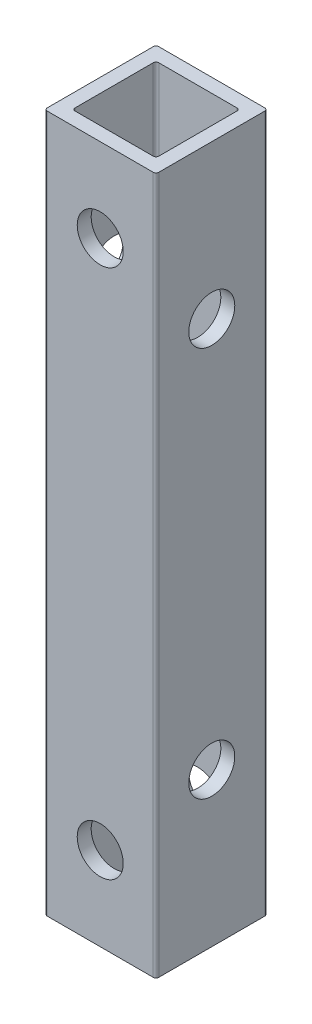
ISO-10303-21;
HEADER;
FILE_DESCRIPTION(('STEP AP214'),'2;1');
FILE_NAME('part.step','',(''),(''),'','','');
FILE_SCHEMA(('AUTOMOTIVE_DESIGN { 1 0 10303 214 1 1 1 1 }'));
ENDSEC;
DATA;
#1=APPLICATION_CONTEXT('core data for automotive mechanical design processes');
#2=APPLICATION_PROTOCOL_DEFINITION('international standard','automotive_design',2000,#1);
#3=PRODUCT_CONTEXT('',#1,'mechanical');
#4=PRODUCT('Part','Part','',(#3));
#5=PRODUCT_RELATED_PRODUCT_CATEGORY('part','',(#4));
#6=PRODUCT_DEFINITION_FORMATION('','',#4);
#7=PRODUCT_DEFINITION_CONTEXT('part definition',#1,'design');
#8=PRODUCT_DEFINITION('design','',#6,#7);
#9=PRODUCT_DEFINITION_SHAPE('','',#8);
#10=(LENGTH_UNIT() NAMED_UNIT(*) SI_UNIT(.MILLI.,.METRE.));
#11=(NAMED_UNIT(*) PLANE_ANGLE_UNIT() SI_UNIT($,.RADIAN.));
#12=(NAMED_UNIT(*) SI_UNIT($,.STERADIAN.) SOLID_ANGLE_UNIT());
#13=UNCERTAINTY_MEASURE_WITH_UNIT(LENGTH_MEASURE(1.E-05),#10,'distance_accuracy_value','');
#14=(GEOMETRIC_REPRESENTATION_CONTEXT(3) GLOBAL_UNCERTAINTY_ASSIGNED_CONTEXT((#13)) GLOBAL_UNIT_ASSIGNED_CONTEXT((#10,
#11,#12)) REPRESENTATION_CONTEXT('',''));
#15=CARTESIAN_POINT('',(0.,0.,0.));
#16=DIRECTION('',(0.,0.,1.));
#17=DIRECTION('',(1.,0.,0.));
#18=AXIS2_PLACEMENT_3D('',#15,#16,#17);
#19=CARTESIAN_POINT('',(0.,50.,0.));
#20=DIRECTION('',(0.,1.,0.));
#21=DIRECTION('',(0.,0.,1.));
#22=AXIS2_PLACEMENT_3D('',#19,#20,#21);
#23=PLANE('',#22);
#24=DIRECTION('',(0.,0.,1.));
#25=VECTOR('',#24,1.);
#26=CARTESIAN_POINT('',(-4.,50.,-4.));
#27=LINE('',#26,#25);
#28=CARTESIAN_POINT('',(-4.,50.,-3.8));
#29=VERTEX_POINT('',#28);
#30=CARTESIAN_POINT('',(-4.,50.,3.8));
#31=VERTEX_POINT('',#30);
#32=EDGE_CURVE('E189',#29,#31,#27,.T.);
#33=ORIENTED_EDGE('',*,*,#32,.T.);
#34=CARTESIAN_POINT('',(-3.8,50.,3.8));
#35=DIRECTION('',(0.,1.,0.));
#36=DIRECTION('',(0.,0.,1.));
#37=AXIS2_PLACEMENT_3D('',#34,#35,#36);
#38=CIRCLE('',#37,0.2);
#39=CARTESIAN_POINT('',(-3.8,50.,4.));
#40=VERTEX_POINT('',#39);
#41=EDGE_CURVE('E267',#31,#40,#38,.T.);
#42=ORIENTED_EDGE('',*,*,#41,.T.);
#43=DIRECTION('',(1.,0.,0.));
#44=VECTOR('',#43,1.);
#45=CARTESIAN_POINT('',(-4.,50.,4.));
#46=LINE('',#45,#44);
#47=CARTESIAN_POINT('',(3.8,50.,4.));
#48=VERTEX_POINT('',#47);
#49=EDGE_CURVE('E182',#40,#48,#46,.T.);
#50=ORIENTED_EDGE('',*,*,#49,.T.);
#51=CARTESIAN_POINT('',(3.8,50.,3.8));
#52=DIRECTION('',(0.,1.,0.));
#53=DIRECTION('',(0.,0.,1.));
#54=AXIS2_PLACEMENT_3D('',#51,#52,#53);
#55=CIRCLE('',#54,0.2);
#56=CARTESIAN_POINT('',(4.,50.,3.8));
#57=VERTEX_POINT('',#56);
#58=EDGE_CURVE('E264',#48,#57,#55,.T.);
#59=ORIENTED_EDGE('',*,*,#58,.T.);
#60=DIRECTION('',(0.,0.,-1.));
#61=VECTOR('',#60,1.);
#62=CARTESIAN_POINT('',(4.,50.,-4.));
#63=LINE('',#62,#61);
#64=CARTESIAN_POINT('',(4.,50.,-3.8));
#65=VERTEX_POINT('',#64);
#66=EDGE_CURVE('E368',#57,#65,#63,.T.);
#67=ORIENTED_EDGE('',*,*,#66,.T.);
#68=CARTESIAN_POINT('',(3.8,50.,-3.8));
#69=DIRECTION('',(0.,1.,0.));
#70=DIRECTION('',(0.,0.,1.));
#71=AXIS2_PLACEMENT_3D('',#68,#69,#70);
#72=CIRCLE('',#71,0.2);
#73=CARTESIAN_POINT('',(3.8,50.,-4.));
#74=VERTEX_POINT('',#73);
#75=EDGE_CURVE('E61',#65,#74,#72,.T.);
#76=ORIENTED_EDGE('',*,*,#75,.T.);
#77=DIRECTION('',(-1.,0.,0.));
#78=VECTOR('',#77,1.);
#79=CARTESIAN_POINT('',(-4.,50.,-4.));
#80=LINE('',#79,#78);
#81=CARTESIAN_POINT('',(-3.8,50.,-4.));
#82=VERTEX_POINT('',#81);
#83=EDGE_CURVE('E371',#74,#82,#80,.T.);
#84=ORIENTED_EDGE('',*,*,#83,.T.);
#85=CARTESIAN_POINT('',(-3.8,50.,-3.8));
#86=DIRECTION('',(0.,1.,0.));
#87=DIRECTION('',(0.,0.,1.));
#88=AXIS2_PLACEMENT_3D('',#85,#86,#87);
#89=CIRCLE('',#88,0.2);
#90=EDGE_CURVE('E261',#82,#29,#89,.T.);
#91=ORIENTED_EDGE('',*,*,#90,.T.);
#92=EDGE_LOOP('',(#33,#42,#50,#59,#67,#76,#84,#91));
#93=FACE_BOUND('',#92,.T.);
#94=DIRECTION('',(-1.,0.,0.));
#95=VECTOR('',#94,1.);
#96=CARTESIAN_POINT('',(-3.,50.,-3.));
#97=LINE('',#96,#95);
#98=CARTESIAN_POINT('',(2.8,50.,-3.));
#99=VERTEX_POINT('',#98);
#100=CARTESIAN_POINT('',(-2.8,50.,-3.));
#101=VERTEX_POINT('',#100);
#102=EDGE_CURVE('E347',#99,#101,#97,.T.);
#103=ORIENTED_EDGE('',*,*,#102,.F.);
#104=CARTESIAN_POINT('',(2.8,50.,-2.8));
#105=DIRECTION('',(0.,1.,0.));
#106=DIRECTION('',(0.,0.,1.));
#107=AXIS2_PLACEMENT_3D('',#104,#105,#106);
#108=CIRCLE('',#107,0.2);
#109=CARTESIAN_POINT('',(3.,50.,-2.8));
#110=VERTEX_POINT('',#109);
#111=EDGE_CURVE('E224',#99,#110,#108,.F.);
#112=ORIENTED_EDGE('',*,*,#111,.T.);
#113=DIRECTION('',(0.,0.,-1.));
#114=VECTOR('',#113,1.);
#115=CARTESIAN_POINT('',(3.,50.,-3.));
#116=LINE('',#115,#114);
#117=CARTESIAN_POINT('',(3.,50.,2.8));
#118=VERTEX_POINT('',#117);
#119=EDGE_CURVE('E177',#118,#110,#116,.T.);
#120=ORIENTED_EDGE('',*,*,#119,.F.);
#121=CARTESIAN_POINT('',(2.8,50.,2.8));
#122=DIRECTION('',(0.,1.,0.));
#123=DIRECTION('',(0.,0.,1.));
#124=AXIS2_PLACEMENT_3D('',#121,#122,#123);
#125=CIRCLE('',#124,0.2);
#126=CARTESIAN_POINT('',(2.8,50.,3.));
#127=VERTEX_POINT('',#126);
#128=EDGE_CURVE('E166',#118,#127,#125,.F.);
#129=ORIENTED_EDGE('',*,*,#128,.T.);
#130=DIRECTION('',(1.,0.,0.));
#131=VECTOR('',#130,1.);
#132=CARTESIAN_POINT('',(-3.,50.,3.));
#133=LINE('',#132,#131);
#134=CARTESIAN_POINT('',(-2.8,50.,3.));
#135=VERTEX_POINT('',#134);
#136=EDGE_CURVE('E355',#135,#127,#133,.T.);
#137=ORIENTED_EDGE('',*,*,#136,.F.);
#138=CARTESIAN_POINT('',(-2.8,50.,2.8));
#139=DIRECTION('',(0.,1.,0.));
#140=DIRECTION('',(0.,0.,1.));
#141=AXIS2_PLACEMENT_3D('',#138,#139,#140);
#142=CIRCLE('',#141,0.2);
#143=CARTESIAN_POINT('',(-3.,50.,2.8));
#144=VERTEX_POINT('',#143);
#145=EDGE_CURVE('E165',#135,#144,#142,.F.);
#146=ORIENTED_EDGE('',*,*,#145,.T.);
#147=DIRECTION('',(0.,0.,1.));
#148=VECTOR('',#147,1.);
#149=CARTESIAN_POINT('',(-3.,50.,-3.));
#150=LINE('',#149,#148);
#151=CARTESIAN_POINT('',(-3.,50.,-2.8));
#152=VERTEX_POINT('',#151);
#153=EDGE_CURVE('E351',#152,#144,#150,.T.);
#154=ORIENTED_EDGE('',*,*,#153,.F.);
#155=CARTESIAN_POINT('',(-2.8,50.,-2.8));
#156=DIRECTION('',(0.,1.,0.));
#157=DIRECTION('',(0.,0.,1.));
#158=AXIS2_PLACEMENT_3D('',#155,#156,#157);
#159=CIRCLE('',#158,0.2);
#160=EDGE_CURVE('E230',#152,#101,#159,.F.);
#161=ORIENTED_EDGE('',*,*,#160,.T.);
#162=EDGE_LOOP('',(#103,#112,#120,#129,#137,#146,#154,#161));
#163=FACE_BOUND('',#162,.T.);
#164=ADVANCED_FACE('F38',(#93,#163),#23,.T.);
#165=CARTESIAN_POINT('',(0.,0.,0.));
#166=DIRECTION('',(0.,1.,0.));
#167=DIRECTION('',(0.,0.,1.));
#168=AXIS2_PLACEMENT_3D('',#165,#166,#167);
#169=PLANE('',#168);
#170=DIRECTION('',(1.,0.,0.));
#171=VECTOR('',#170,1.);
#172=CARTESIAN_POINT('',(-4.,0.,4.));
#173=LINE('',#172,#171);
#174=CARTESIAN_POINT('',(-3.8,0.,4.));
#175=VERTEX_POINT('',#174);
#176=CARTESIAN_POINT('',(3.8,0.,4.));
#177=VERTEX_POINT('',#176);
#178=EDGE_CURVE('E192',#175,#177,#173,.T.);
#179=ORIENTED_EDGE('',*,*,#178,.F.);
#180=CARTESIAN_POINT('',(-3.8,0.,3.8));
#181=DIRECTION('',(0.,1.,0.));
#182=DIRECTION('',(0.,0.,1.));
#183=AXIS2_PLACEMENT_3D('',#180,#181,#182);
#184=CIRCLE('',#183,0.2);
#185=CARTESIAN_POINT('',(-4.,0.,3.8));
#186=VERTEX_POINT('',#185);
#187=EDGE_CURVE('E249',#175,#186,#184,.F.);
#188=ORIENTED_EDGE('',*,*,#187,.T.);
#189=DIRECTION('',(0.,0.,1.));
#190=VECTOR('',#189,1.);
#191=CARTESIAN_POINT('',(-4.,0.,-4.));
#192=LINE('',#191,#190);
#193=CARTESIAN_POINT('',(-4.,0.,-3.8));
#194=VERTEX_POINT('',#193);
#195=EDGE_CURVE('E382',#194,#186,#192,.T.);
#196=ORIENTED_EDGE('',*,*,#195,.F.);
#197=CARTESIAN_POINT('',(-3.8,0.,-3.8));
#198=DIRECTION('',(0.,1.,0.));
#199=DIRECTION('',(0.,0.,1.));
#200=AXIS2_PLACEMENT_3D('',#197,#198,#199);
#201=CIRCLE('',#200,0.2);
#202=CARTESIAN_POINT('',(-3.8,0.,-4.));
#203=VERTEX_POINT('',#202);
#204=EDGE_CURVE('E243',#194,#203,#201,.F.);
#205=ORIENTED_EDGE('',*,*,#204,.T.);
#206=DIRECTION('',(-1.,0.,0.));
#207=VECTOR('',#206,1.);
#208=CARTESIAN_POINT('',(-4.,0.,-4.));
#209=LINE('',#208,#207);
#210=CARTESIAN_POINT('',(3.8,0.,-4.));
#211=VERTEX_POINT('',#210);
#212=EDGE_CURVE('E380',#211,#203,#209,.T.);
#213=ORIENTED_EDGE('',*,*,#212,.F.);
#214=CARTESIAN_POINT('',(3.8,0.,-3.8));
#215=DIRECTION('',(0.,1.,0.));
#216=DIRECTION('',(0.,0.,1.));
#217=AXIS2_PLACEMENT_3D('',#214,#215,#216);
#218=CIRCLE('',#217,0.2);
#219=CARTESIAN_POINT('',(4.,0.,-3.8));
#220=VERTEX_POINT('',#219);
#221=EDGE_CURVE('E240',#211,#220,#218,.F.);
#222=ORIENTED_EDGE('',*,*,#221,.T.);
#223=DIRECTION('',(0.,0.,-1.));
#224=VECTOR('',#223,1.);
#225=CARTESIAN_POINT('',(4.,0.,-4.));
#226=LINE('',#225,#224);
#227=CARTESIAN_POINT('',(4.,0.,3.8));
#228=VERTEX_POINT('',#227);
#229=EDGE_CURVE('E358',#228,#220,#226,.T.);
#230=ORIENTED_EDGE('',*,*,#229,.F.);
#231=CARTESIAN_POINT('',(3.8,0.,3.8));
#232=DIRECTION('',(0.,1.,0.));
#233=DIRECTION('',(0.,0.,1.));
#234=AXIS2_PLACEMENT_3D('',#231,#232,#233);
#235=CIRCLE('',#234,0.2);
#236=EDGE_CURVE('E246',#228,#177,#235,.F.);
#237=ORIENTED_EDGE('',*,*,#236,.T.);
#238=EDGE_LOOP('',(#179,#188,#196,#205,#213,#222,#230,#237));
#239=FACE_BOUND('',#238,.T.);
#240=DIRECTION('',(1.,0.,0.));
#241=VECTOR('',#240,1.);
#242=CARTESIAN_POINT('',(-3.,0.,3.));
#243=LINE('',#242,#241);
#244=CARTESIAN_POINT('',(-2.8,0.,3.));
#245=VERTEX_POINT('',#244);
#246=CARTESIAN_POINT('',(2.8,0.,3.));
#247=VERTEX_POINT('',#246);
#248=EDGE_CURVE('E157',#245,#247,#243,.T.);
#249=ORIENTED_EDGE('',*,*,#248,.T.);
#250=CARTESIAN_POINT('',(2.8,0.,2.8));
#251=DIRECTION('',(0.,1.,0.));
#252=DIRECTION('',(0.,0.,1.));
#253=AXIS2_PLACEMENT_3D('',#250,#251,#252);
#254=CIRCLE('',#253,0.2);
#255=CARTESIAN_POINT('',(3.,0.,2.8));
#256=VERTEX_POINT('',#255);
#257=EDGE_CURVE('E214',#247,#256,#254,.T.);
#258=ORIENTED_EDGE('',*,*,#257,.T.);
#259=DIRECTION('',(0.,0.,-1.));
#260=VECTOR('',#259,1.);
#261=CARTESIAN_POINT('',(3.,0.,-3.));
#262=LINE('',#261,#260);
#263=CARTESIAN_POINT('',(3.,0.,-2.8));
#264=VERTEX_POINT('',#263);
#265=EDGE_CURVE('E343',#256,#264,#262,.T.);
#266=ORIENTED_EDGE('',*,*,#265,.T.);
#267=CARTESIAN_POINT('',(2.8,0.,-2.8));
#268=DIRECTION('',(0.,1.,0.));
#269=DIRECTION('',(0.,0.,1.));
#270=AXIS2_PLACEMENT_3D('',#267,#268,#269);
#271=CIRCLE('',#270,0.2);
#272=CARTESIAN_POINT('',(2.8,0.,-3.));
#273=VERTEX_POINT('',#272);
#274=EDGE_CURVE('E221',#264,#273,#271,.T.);
#275=ORIENTED_EDGE('',*,*,#274,.T.);
#276=DIRECTION('',(-1.,0.,0.));
#277=VECTOR('',#276,1.);
#278=CARTESIAN_POINT('',(-3.,0.,-3.));
#279=LINE('',#278,#277);
#280=CARTESIAN_POINT('',(-2.8,0.,-3.));
#281=VERTEX_POINT('',#280);
#282=EDGE_CURVE('E362',#273,#281,#279,.T.);
#283=ORIENTED_EDGE('',*,*,#282,.T.);
#284=CARTESIAN_POINT('',(-2.8,0.,-2.8));
#285=DIRECTION('',(0.,1.,0.));
#286=DIRECTION('',(0.,0.,1.));
#287=AXIS2_PLACEMENT_3D('',#284,#285,#286);
#288=CIRCLE('',#287,0.2);
#289=CARTESIAN_POINT('',(-3.,0.,-2.8));
#290=VERTEX_POINT('',#289);
#291=EDGE_CURVE('E227',#281,#290,#288,.T.);
#292=ORIENTED_EDGE('',*,*,#291,.T.);
#293=DIRECTION('',(0.,0.,1.));
#294=VECTOR('',#293,1.);
#295=CARTESIAN_POINT('',(-3.,0.,-3.));
#296=LINE('',#295,#294);
#297=CARTESIAN_POINT('',(-3.,0.,2.8));
#298=VERTEX_POINT('',#297);
#299=EDGE_CURVE('E159',#290,#298,#296,.T.);
#300=ORIENTED_EDGE('',*,*,#299,.T.);
#301=CARTESIAN_POINT('',(-2.8,0.,2.8));
#302=DIRECTION('',(0.,1.,0.));
#303=DIRECTION('',(0.,0.,1.));
#304=AXIS2_PLACEMENT_3D('',#301,#302,#303);
#305=CIRCLE('',#304,0.2);
#306=EDGE_CURVE('E154',#298,#245,#305,.T.);
#307=ORIENTED_EDGE('',*,*,#306,.T.);
#308=EDGE_LOOP('',(#249,#258,#266,#275,#283,#292,#300,#307));
#309=FACE_BOUND('',#308,.T.);
#310=ADVANCED_FACE('F156',(#239,#309),#169,.F.);
#311=CARTESIAN_POINT('',(4.,50.,-4.));
#312=DIRECTION('',(-1.,0.,0.));
#313=DIRECTION('',(0.,0.,1.));
#314=AXIS2_PLACEMENT_3D('',#311,#312,#313);
#315=PLANE('',#314);
#316=CARTESIAN_POINT('',(4.,39.,0.));
#317=DIRECTION('',(1.,0.,0.));
#318=DIRECTION('',(0.,0.,-1.));
#319=AXIS2_PLACEMENT_3D('',#316,#317,#318);
#320=CIRCLE('',#319,1.65);
#321=CARTESIAN_POINT('',(4.,39.,-1.65));
#322=VERTEX_POINT('',#321);
#323=EDGE_CURVE('E285',#322,#322,#320,.T.);
#324=ORIENTED_EDGE('',*,*,#323,.F.);
#325=EDGE_LOOP('',(#324));
#326=FACE_BOUND('',#325,.T.);
#327=CARTESIAN_POINT('',(4.,11.,0.));
#328=DIRECTION('',(1.,0.,0.));
#329=DIRECTION('',(0.,0.,1.));
#330=AXIS2_PLACEMENT_3D('',#327,#328,#329);
#331=CIRCLE('',#330,1.65);
#332=CARTESIAN_POINT('',(4.,11.,1.65));
#333=VERTEX_POINT('',#332);
#334=EDGE_CURVE('E323',#333,#333,#331,.T.);
#335=ORIENTED_EDGE('',*,*,#334,.F.);
#336=EDGE_LOOP('',(#335));
#337=FACE_BOUND('',#336,.T.);
#338=ORIENTED_EDGE('',*,*,#66,.F.);
#339=DIRECTION('',(0.,-1.,0.));
#340=VECTOR('',#339,1.);
#341=CARTESIAN_POINT('',(4.,50.,3.8));
#342=LINE('',#341,#340);
#343=EDGE_CURVE('E273',#57,#228,#342,.T.);
#344=ORIENTED_EDGE('',*,*,#343,.T.);
#345=ORIENTED_EDGE('',*,*,#229,.T.);
#346=DIRECTION('',(0.,-1.,0.));
#347=VECTOR('',#346,1.);
#348=CARTESIAN_POINT('',(4.,50.,-3.8));
#349=LINE('',#348,#347);
#350=EDGE_CURVE('E270',#220,#65,#349,.F.);
#351=ORIENTED_EDGE('',*,*,#350,.T.);
#352=EDGE_LOOP('',(#338,#344,#345,#351));
#353=FACE_BOUND('',#352,.T.);
#354=ADVANCED_FACE('F404',(#326,#337,#353),#315,.F.);
#355=CARTESIAN_POINT('',(-4.,50.,-4.));
#356=DIRECTION('',(0.,0.,1.));
#357=DIRECTION('',(1.,0.,0.));
#358=AXIS2_PLACEMENT_3D('',#355,#356,#357);
#359=PLANE('',#358);
#360=CARTESIAN_POINT('',(0.,44.,-4.));
#361=DIRECTION('',(0.,0.,-1.));
#362=DIRECTION('',(-1.,0.,0.));
#363=AXIS2_PLACEMENT_3D('',#360,#361,#362);
#364=CIRCLE('',#363,1.65);
#365=CARTESIAN_POINT('',(-1.65,44.,-4.));
#366=VERTEX_POINT('',#365);
#367=EDGE_CURVE('E295',#366,#366,#364,.T.);
#368=ORIENTED_EDGE('',*,*,#367,.F.);
#369=EDGE_LOOP('',(#368));
#370=FACE_BOUND('',#369,.T.);
#371=CARTESIAN_POINT('',(0.,6.00000000000001,-4.));
#372=DIRECTION('',(0.,0.,-1.));
#373=DIRECTION('',(1.,0.,0.));
#374=AXIS2_PLACEMENT_3D('',#371,#372,#373);
#375=CIRCLE('',#374,1.65);
#376=CARTESIAN_POINT('',(1.65,6.00000000000001,-4.));
#377=VERTEX_POINT('',#376);
#378=EDGE_CURVE('E304',#377,#377,#375,.T.);
#379=ORIENTED_EDGE('',*,*,#378,.F.);
#380=EDGE_LOOP('',(#379));
#381=FACE_BOUND('',#380,.T.);
#382=ORIENTED_EDGE('',*,*,#212,.T.);
#383=DIRECTION('',(0.,-1.,0.));
#384=VECTOR('',#383,1.);
#385=CARTESIAN_POINT('',(-3.8,50.,-4.));
#386=LINE('',#385,#384);
#387=EDGE_CURVE('E11',#203,#82,#386,.F.);
#388=ORIENTED_EDGE('',*,*,#387,.T.);
#389=ORIENTED_EDGE('',*,*,#83,.F.);
#390=DIRECTION('',(0.,-1.,0.));
#391=VECTOR('',#390,1.);
#392=CARTESIAN_POINT('',(3.8,50.,-4.));
#393=LINE('',#392,#391);
#394=EDGE_CURVE('E48',#74,#211,#393,.T.);
#395=ORIENTED_EDGE('',*,*,#394,.T.);
#396=EDGE_LOOP('',(#382,#388,#389,#395));
#397=FACE_BOUND('',#396,.T.);
#398=ADVANCED_FACE('F410',(#370,#381,#397),#359,.F.);
#399=CARTESIAN_POINT('',(-4.,50.,-4.));
#400=DIRECTION('',(1.,0.,0.));
#401=DIRECTION('',(0.,0.,-1.));
#402=AXIS2_PLACEMENT_3D('',#399,#400,#401);
#403=PLANE('',#402);
#404=CARTESIAN_POINT('',(-4.,39.,0.));
#405=DIRECTION('',(1.,0.,0.));
#406=DIRECTION('',(0.,0.,-1.));
#407=AXIS2_PLACEMENT_3D('',#404,#405,#406);
#408=CIRCLE('',#407,1.65);
#409=CARTESIAN_POINT('',(-4.,39.,-1.65));
#410=VERTEX_POINT('',#409);
#411=EDGE_CURVE('E339',#410,#410,#408,.T.);
#412=ORIENTED_EDGE('',*,*,#411,.T.);
#413=EDGE_LOOP('',(#412));
#414=FACE_BOUND('',#413,.T.);
#415=CARTESIAN_POINT('',(-4.,11.,0.));
#416=DIRECTION('',(1.,0.,0.));
#417=DIRECTION('',(0.,0.,-1.));
#418=AXIS2_PLACEMENT_3D('',#415,#416,#417);
#419=CIRCLE('',#418,1.65);
#420=CARTESIAN_POINT('',(-4.,11.,-1.65));
#421=VERTEX_POINT('',#420);
#422=EDGE_CURVE('E290',#421,#421,#419,.T.);
#423=ORIENTED_EDGE('',*,*,#422,.T.);
#424=EDGE_LOOP('',(#423));
#425=FACE_BOUND('',#424,.T.);
#426=ORIENTED_EDGE('',*,*,#195,.T.);
#427=DIRECTION('',(0.,-1.,0.));
#428=VECTOR('',#427,1.);
#429=CARTESIAN_POINT('',(-4.,50.,3.8));
#430=LINE('',#429,#428);
#431=EDGE_CURVE('E256',#186,#31,#430,.F.);
#432=ORIENTED_EDGE('',*,*,#431,.T.);
#433=ORIENTED_EDGE('',*,*,#32,.F.);
#434=DIRECTION('',(0.,-1.,0.));
#435=VECTOR('',#434,1.);
#436=CARTESIAN_POINT('',(-4.,50.,-3.8));
#437=LINE('',#436,#435);
#438=EDGE_CURVE('E252',#29,#194,#437,.T.);
#439=ORIENTED_EDGE('',*,*,#438,.T.);
#440=EDGE_LOOP('',(#426,#432,#433,#439));
#441=FACE_BOUND('',#440,.T.);
#442=ADVANCED_FACE('F416',(#414,#425,#441),#403,.F.);
#443=CARTESIAN_POINT('',(-4.,50.,4.));
#444=DIRECTION('',(0.,0.,-1.));
#445=DIRECTION('',(-1.,0.,0.));
#446=AXIS2_PLACEMENT_3D('',#443,#444,#445);
#447=PLANE('',#446);
#448=CARTESIAN_POINT('',(0.,44.,4.));
#449=DIRECTION('',(0.,0.,-1.));
#450=DIRECTION('',(-1.,0.,0.));
#451=AXIS2_PLACEMENT_3D('',#448,#449,#450);
#452=CIRCLE('',#451,1.65);
#453=CARTESIAN_POINT('',(-1.65,44.,4.));
#454=VERTEX_POINT('',#453);
#455=EDGE_CURVE('E319',#454,#454,#452,.T.);
#456=ORIENTED_EDGE('',*,*,#455,.T.);
#457=EDGE_LOOP('',(#456));
#458=FACE_BOUND('',#457,.T.);
#459=CARTESIAN_POINT('',(0.,6.00000000000001,4.));
#460=DIRECTION('',(0.,0.,-1.));
#461=DIRECTION('',(-1.,0.,0.));
#462=AXIS2_PLACEMENT_3D('',#459,#460,#461);
#463=CIRCLE('',#462,1.65);
#464=CARTESIAN_POINT('',(-1.65,6.00000000000001,4.));
#465=VERTEX_POINT('',#464);
#466=EDGE_CURVE('E301',#465,#465,#463,.T.);
#467=ORIENTED_EDGE('',*,*,#466,.T.);
#468=EDGE_LOOP('',(#467));
#469=FACE_BOUND('',#468,.T.);
#470=ORIENTED_EDGE('',*,*,#49,.F.);
#471=DIRECTION('',(0.,-1.,0.));
#472=VECTOR('',#471,1.);
#473=CARTESIAN_POINT('',(-3.8,50.,4.));
#474=LINE('',#473,#472);
#475=EDGE_CURVE('E236',#40,#175,#474,.T.);
#476=ORIENTED_EDGE('',*,*,#475,.T.);
#477=ORIENTED_EDGE('',*,*,#178,.T.);
#478=DIRECTION('',(0.,-1.,0.));
#479=VECTOR('',#478,1.);
#480=CARTESIAN_POINT('',(3.8,50.,4.));
#481=LINE('',#480,#479);
#482=EDGE_CURVE('E233',#177,#48,#481,.F.);
#483=ORIENTED_EDGE('',*,*,#482,.T.);
#484=EDGE_LOOP('',(#470,#476,#477,#483));
#485=FACE_BOUND('',#484,.T.);
#486=ADVANCED_FACE('F394',(#458,#469,#485),#447,.F.);
#487=CARTESIAN_POINT('',(3.,50.,-3.));
#488=DIRECTION('',(-1.,0.,0.));
#489=DIRECTION('',(0.,0.,1.));
#490=AXIS2_PLACEMENT_3D('',#487,#488,#489);
#491=PLANE('',#490);
#492=CARTESIAN_POINT('',(3.,39.,0.));
#493=DIRECTION('',(-1.,0.,0.));
#494=DIRECTION('',(0.,0.,1.));
#495=AXIS2_PLACEMENT_3D('',#492,#493,#494);
#496=CIRCLE('',#495,1.65);
#497=CARTESIAN_POINT('',(3.,39.,1.65));
#498=VERTEX_POINT('',#497);
#499=EDGE_CURVE('E289',#498,#498,#496,.T.);
#500=ORIENTED_EDGE('',*,*,#499,.F.);
#501=EDGE_LOOP('',(#500));
#502=FACE_BOUND('',#501,.T.);
#503=CARTESIAN_POINT('',(3.,11.,0.));
#504=DIRECTION('',(-1.,0.,0.));
#505=DIRECTION('',(0.,0.,1.));
#506=AXIS2_PLACEMENT_3D('',#503,#504,#505);
#507=CIRCLE('',#506,1.65);
#508=CARTESIAN_POINT('',(3.,11.,1.65));
#509=VERTEX_POINT('',#508);
#510=EDGE_CURVE('E284',#509,#509,#507,.T.);
#511=ORIENTED_EDGE('',*,*,#510,.F.);
#512=EDGE_LOOP('',(#511));
#513=FACE_BOUND('',#512,.T.);
#514=ORIENTED_EDGE('',*,*,#265,.F.);
#515=DIRECTION('',(0.,-1.,0.));
#516=VECTOR('',#515,1.);
#517=CARTESIAN_POINT('',(3.,50.,2.8));
#518=LINE('',#517,#516);
#519=EDGE_CURVE('E198',#256,#118,#518,.F.);
#520=ORIENTED_EDGE('',*,*,#519,.T.);
#521=ORIENTED_EDGE('',*,*,#119,.T.);
#522=DIRECTION('',(0.,-1.,0.));
#523=VECTOR('',#522,1.);
#524=CARTESIAN_POINT('',(3.,0.,-2.8));
#525=LINE('',#524,#523);
#526=EDGE_CURVE('E186',#110,#264,#525,.T.);
#527=ORIENTED_EDGE('',*,*,#526,.T.);
#528=EDGE_LOOP('',(#514,#520,#521,#527));
#529=FACE_BOUND('',#528,.T.);
#530=ADVANCED_FACE('F438',(#502,#513,#529),#491,.T.);
#531=CARTESIAN_POINT('',(-3.,50.,-3.));
#532=DIRECTION('',(0.,0.,1.));
#533=DIRECTION('',(1.,0.,0.));
#534=AXIS2_PLACEMENT_3D('',#531,#532,#533);
#535=PLANE('',#534);
#536=CARTESIAN_POINT('',(0.,44.,-3.));
#537=DIRECTION('',(0.,0.,1.));
#538=DIRECTION('',(1.,0.,0.));
#539=AXIS2_PLACEMENT_3D('',#536,#537,#538);
#540=CIRCLE('',#539,1.65);
#541=CARTESIAN_POINT('',(1.65,44.,-3.));
#542=VERTEX_POINT('',#541);
#543=EDGE_CURVE('E315',#542,#542,#540,.T.);
#544=ORIENTED_EDGE('',*,*,#543,.F.);
#545=EDGE_LOOP('',(#544));
#546=FACE_BOUND('',#545,.T.);
#547=CARTESIAN_POINT('',(0.,6.00000000000001,-3.));
#548=DIRECTION('',(0.,0.,1.));
#549=DIRECTION('',(1.,0.,0.));
#550=AXIS2_PLACEMENT_3D('',#547,#548,#549);
#551=CIRCLE('',#550,1.65);
#552=CARTESIAN_POINT('',(1.65,6.00000000000001,-3.));
#553=VERTEX_POINT('',#552);
#554=EDGE_CURVE('E294',#553,#553,#551,.T.);
#555=ORIENTED_EDGE('',*,*,#554,.F.);
#556=EDGE_LOOP('',(#555));
#557=FACE_BOUND('',#556,.T.);
#558=ORIENTED_EDGE('',*,*,#282,.F.);
#559=DIRECTION('',(0.,-1.,0.));
#560=VECTOR('',#559,1.);
#561=CARTESIAN_POINT('',(2.8,50.,-3.));
#562=LINE('',#561,#560);
#563=EDGE_CURVE('E211',#273,#99,#562,.F.);
#564=ORIENTED_EDGE('',*,*,#563,.T.);
#565=ORIENTED_EDGE('',*,*,#102,.T.);
#566=DIRECTION('',(0.,-1.,0.));
#567=VECTOR('',#566,1.);
#568=CARTESIAN_POINT('',(-2.8,0.,-3.));
#569=LINE('',#568,#567);
#570=EDGE_CURVE('E207',#101,#281,#569,.T.);
#571=ORIENTED_EDGE('',*,*,#570,.T.);
#572=EDGE_LOOP('',(#558,#564,#565,#571));
#573=FACE_BOUND('',#572,.T.);
#574=ADVANCED_FACE('F480',(#546,#557,#573),#535,.T.);
#575=CARTESIAN_POINT('',(-3.,50.,-3.));
#576=DIRECTION('',(1.,0.,0.));
#577=DIRECTION('',(0.,0.,-1.));
#578=AXIS2_PLACEMENT_3D('',#575,#576,#577);
#579=PLANE('',#578);
#580=CARTESIAN_POINT('',(-3.,39.,0.));
#581=DIRECTION('',(1.,0.,0.));
#582=DIRECTION('',(0.,0.,-1.));
#583=AXIS2_PLACEMENT_3D('',#580,#581,#582);
#584=CIRCLE('',#583,1.65);
#585=CARTESIAN_POINT('',(-3.,39.,-1.65));
#586=VERTEX_POINT('',#585);
#587=EDGE_CURVE('E286',#586,#586,#584,.T.);
#588=ORIENTED_EDGE('',*,*,#587,.F.);
#589=EDGE_LOOP('',(#588));
#590=FACE_BOUND('',#589,.T.);
#591=CARTESIAN_POINT('',(-3.,11.,0.));
#592=DIRECTION('',(1.,0.,0.));
#593=DIRECTION('',(0.,0.,-1.));
#594=AXIS2_PLACEMENT_3D('',#591,#592,#593);
#595=CIRCLE('',#594,1.65);
#596=CARTESIAN_POINT('',(-3.,11.,-1.65));
#597=VERTEX_POINT('',#596);
#598=EDGE_CURVE('E280',#597,#597,#595,.T.);
#599=ORIENTED_EDGE('',*,*,#598,.F.);
#600=EDGE_LOOP('',(#599));
#601=FACE_BOUND('',#600,.T.);
#602=ORIENTED_EDGE('',*,*,#153,.T.);
#603=DIRECTION('',(0.,-1.,0.));
#604=VECTOR('',#603,1.);
#605=CARTESIAN_POINT('',(-3.,0.,2.8));
#606=LINE('',#605,#604);
#607=EDGE_CURVE('E204',#144,#298,#606,.T.);
#608=ORIENTED_EDGE('',*,*,#607,.T.);
#609=ORIENTED_EDGE('',*,*,#299,.F.);
#610=DIRECTION('',(0.,-1.,0.));
#611=VECTOR('',#610,1.);
#612=CARTESIAN_POINT('',(-3.,50.,-2.8));
#613=LINE('',#612,#611);
#614=EDGE_CURVE('E201',#290,#152,#613,.F.);
#615=ORIENTED_EDGE('',*,*,#614,.T.);
#616=EDGE_LOOP('',(#602,#608,#609,#615));
#617=FACE_BOUND('',#616,.T.);
#618=ADVANCED_FACE('F475',(#590,#601,#617),#579,.T.);
#619=CARTESIAN_POINT('',(-3.,50.,3.));
#620=DIRECTION('',(0.,0.,-1.));
#621=DIRECTION('',(-1.,0.,0.));
#622=AXIS2_PLACEMENT_3D('',#619,#620,#621);
#623=PLANE('',#622);
#624=CARTESIAN_POINT('',(0.,44.,3.));
#625=DIRECTION('',(0.,0.,-1.));
#626=DIRECTION('',(-1.,0.,0.));
#627=AXIS2_PLACEMENT_3D('',#624,#625,#626);
#628=CIRCLE('',#627,1.65);
#629=CARTESIAN_POINT('',(-1.65,44.,3.));
#630=VERTEX_POINT('',#629);
#631=EDGE_CURVE('E42',#630,#630,#628,.T.);
#632=ORIENTED_EDGE('',*,*,#631,.F.);
#633=EDGE_LOOP('',(#632));
#634=FACE_BOUND('',#633,.T.);
#635=CARTESIAN_POINT('',(0.,6.00000000000001,3.));
#636=DIRECTION('',(0.,0.,-1.));
#637=DIRECTION('',(-1.,0.,0.));
#638=AXIS2_PLACEMENT_3D('',#635,#636,#637);
#639=CIRCLE('',#638,1.65);
#640=CARTESIAN_POINT('',(-1.65,6.00000000000001,3.));
#641=VERTEX_POINT('',#640);
#642=EDGE_CURVE('E291',#641,#641,#639,.T.);
#643=ORIENTED_EDGE('',*,*,#642,.F.);
#644=EDGE_LOOP('',(#643));
#645=FACE_BOUND('',#644,.T.);
#646=ORIENTED_EDGE('',*,*,#136,.T.);
#647=DIRECTION('',(0.,-1.,0.));
#648=VECTOR('',#647,1.);
#649=CARTESIAN_POINT('',(2.8,0.,3.));
#650=LINE('',#649,#648);
#651=EDGE_CURVE('E175',#127,#247,#650,.T.);
#652=ORIENTED_EDGE('',*,*,#651,.T.);
#653=ORIENTED_EDGE('',*,*,#248,.F.);
#654=DIRECTION('',(0.,-1.,0.));
#655=VECTOR('',#654,1.);
#656=CARTESIAN_POINT('',(-2.8,50.,3.));
#657=LINE('',#656,#655);
#658=EDGE_CURVE('E172',#245,#135,#657,.F.);
#659=ORIENTED_EDGE('',*,*,#658,.T.);
#660=EDGE_LOOP('',(#646,#652,#653,#659));
#661=FACE_BOUND('',#660,.T.);
#662=ADVANCED_FACE('F171',(#634,#645,#661),#623,.T.);
#663=CARTESIAN_POINT('',(2.8,50.,2.8));
#664=DIRECTION('',(0.,1.,0.));
#665=DIRECTION('',(0.,0.,1.));
#666=AXIS2_PLACEMENT_3D('',#663,#664,#665);
#667=CYLINDRICAL_SURFACE('',#666,0.2);
#668=ORIENTED_EDGE('',*,*,#128,.F.);
#669=ORIENTED_EDGE('',*,*,#519,.F.);
#670=ORIENTED_EDGE('',*,*,#257,.F.);
#671=ORIENTED_EDGE('',*,*,#651,.F.);
#672=EDGE_LOOP('',(#668,#669,#670,#671));
#673=FACE_BOUND('',#672,.T.);
#674=ADVANCED_FACE('F453',(#673),#667,.F.);
#675=CARTESIAN_POINT('',(-2.8,50.,2.8));
#676=DIRECTION('',(0.,1.,0.));
#677=DIRECTION('',(0.,0.,1.));
#678=AXIS2_PLACEMENT_3D('',#675,#676,#677);
#679=CYLINDRICAL_SURFACE('',#678,0.2);
#680=ORIENTED_EDGE('',*,*,#145,.F.);
#681=ORIENTED_EDGE('',*,*,#658,.F.);
#682=ORIENTED_EDGE('',*,*,#306,.F.);
#683=ORIENTED_EDGE('',*,*,#607,.F.);
#684=EDGE_LOOP('',(#680,#681,#682,#683));
#685=FACE_BOUND('',#684,.T.);
#686=ADVANCED_FACE('F180',(#685),#679,.F.);
#687=CARTESIAN_POINT('',(2.8,50.,-2.8));
#688=DIRECTION('',(0.,1.,0.));
#689=DIRECTION('',(0.,0.,1.));
#690=AXIS2_PLACEMENT_3D('',#687,#688,#689);
#691=CYLINDRICAL_SURFACE('',#690,0.2);
#692=ORIENTED_EDGE('',*,*,#111,.F.);
#693=ORIENTED_EDGE('',*,*,#563,.F.);
#694=ORIENTED_EDGE('',*,*,#274,.F.);
#695=ORIENTED_EDGE('',*,*,#526,.F.);
#696=EDGE_LOOP('',(#692,#693,#694,#695));
#697=FACE_BOUND('',#696,.T.);
#698=ADVANCED_FACE('F428',(#697),#691,.F.);
#699=CARTESIAN_POINT('',(-2.8,50.,-2.8));
#700=DIRECTION('',(0.,1.,0.));
#701=DIRECTION('',(0.,0.,1.));
#702=AXIS2_PLACEMENT_3D('',#699,#700,#701);
#703=CYLINDRICAL_SURFACE('',#702,0.2);
#704=ORIENTED_EDGE('',*,*,#160,.F.);
#705=ORIENTED_EDGE('',*,*,#614,.F.);
#706=ORIENTED_EDGE('',*,*,#291,.F.);
#707=ORIENTED_EDGE('',*,*,#570,.F.);
#708=EDGE_LOOP('',(#704,#705,#706,#707));
#709=FACE_BOUND('',#708,.T.);
#710=ADVANCED_FACE('F421',(#709),#703,.F.);
#711=CARTESIAN_POINT('',(-3.8,50.,3.8));
#712=DIRECTION('',(0.,-1.,0.));
#713=DIRECTION('',(0.,0.,-1.));
#714=AXIS2_PLACEMENT_3D('',#711,#712,#713);
#715=CYLINDRICAL_SURFACE('',#714,0.2);
#716=ORIENTED_EDGE('',*,*,#41,.F.);
#717=ORIENTED_EDGE('',*,*,#431,.F.);
#718=ORIENTED_EDGE('',*,*,#187,.F.);
#719=ORIENTED_EDGE('',*,*,#475,.F.);
#720=EDGE_LOOP('',(#716,#717,#718,#719));
#721=FACE_BOUND('',#720,.T.);
#722=ADVANCED_FACE('F419',(#721),#715,.T.);
#723=CARTESIAN_POINT('',(3.8,50.,3.8));
#724=DIRECTION('',(0.,-1.,0.));
#725=DIRECTION('',(0.,0.,-1.));
#726=AXIS2_PLACEMENT_3D('',#723,#724,#725);
#727=CYLINDRICAL_SURFACE('',#726,0.2);
#728=ORIENTED_EDGE('',*,*,#58,.F.);
#729=ORIENTED_EDGE('',*,*,#482,.F.);
#730=ORIENTED_EDGE('',*,*,#236,.F.);
#731=ORIENTED_EDGE('',*,*,#343,.F.);
#732=EDGE_LOOP('',(#728,#729,#730,#731));
#733=FACE_BOUND('',#732,.T.);
#734=ADVANCED_FACE('F399',(#733),#727,.T.);
#735=CARTESIAN_POINT('',(-3.8,50.,-3.8));
#736=DIRECTION('',(0.,-1.,0.));
#737=DIRECTION('',(0.,0.,-1.));
#738=AXIS2_PLACEMENT_3D('',#735,#736,#737);
#739=CYLINDRICAL_SURFACE('',#738,0.2);
#740=ORIENTED_EDGE('',*,*,#90,.F.);
#741=ORIENTED_EDGE('',*,*,#387,.F.);
#742=ORIENTED_EDGE('',*,*,#204,.F.);
#743=ORIENTED_EDGE('',*,*,#438,.F.);
#744=EDGE_LOOP('',(#740,#741,#742,#743));
#745=FACE_BOUND('',#744,.T.);
#746=ADVANCED_FACE('F414',(#745),#739,.T.);
#747=CARTESIAN_POINT('',(3.8,50.,-3.8));
#748=DIRECTION('',(0.,-1.,0.));
#749=DIRECTION('',(0.,0.,-1.));
#750=AXIS2_PLACEMENT_3D('',#747,#748,#749);
#751=CYLINDRICAL_SURFACE('',#750,0.2);
#752=ORIENTED_EDGE('',*,*,#75,.F.);
#753=ORIENTED_EDGE('',*,*,#350,.F.);
#754=ORIENTED_EDGE('',*,*,#221,.F.);
#755=ORIENTED_EDGE('',*,*,#394,.F.);
#756=EDGE_LOOP('',(#752,#753,#754,#755));
#757=FACE_BOUND('',#756,.T.);
#758=ADVANCED_FACE('F40',(#757),#751,.T.);
#759=CARTESIAN_POINT('',(-46.,11.,0.));
#760=DIRECTION('',(1.,0.,0.));
#761=DIRECTION('',(0.,0.,-1.));
#762=AXIS2_PLACEMENT_3D('',#759,#760,#761);
#763=CYLINDRICAL_SURFACE('',#762,1.65);
#764=ORIENTED_EDGE('',*,*,#598,.T.);
#765=EDGE_LOOP('',(#764));
#766=FACE_BOUND('',#765,.T.);
#767=ORIENTED_EDGE('',*,*,#422,.F.);
#768=EDGE_LOOP('',(#767));
#769=FACE_BOUND('',#768,.T.);
#770=ADVANCED_FACE('F496',(#766,#769),#763,.F.);
#771=CARTESIAN_POINT('',(-46.,39.,0.));
#772=DIRECTION('',(1.,0.,0.));
#773=DIRECTION('',(0.,0.,-1.));
#774=AXIS2_PLACEMENT_3D('',#771,#772,#773);
#775=CYLINDRICAL_SURFACE('',#774,1.65);
#776=ORIENTED_EDGE('',*,*,#587,.T.);
#777=EDGE_LOOP('',(#776));
#778=FACE_BOUND('',#777,.T.);
#779=ORIENTED_EDGE('',*,*,#411,.F.);
#780=EDGE_LOOP('',(#779));
#781=FACE_BOUND('',#780,.T.);
#782=ADVANCED_FACE('F499',(#778,#781),#775,.F.);
#783=ORIENTED_EDGE('',*,*,#510,.T.);
#784=EDGE_LOOP('',(#783));
#785=FACE_BOUND('',#784,.T.);
#786=ORIENTED_EDGE('',*,*,#334,.T.);
#787=EDGE_LOOP('',(#786));
#788=FACE_BOUND('',#787,.T.);
#789=ADVANCED_FACE('F501',(#785,#788),#763,.F.);
#790=ORIENTED_EDGE('',*,*,#499,.T.);
#791=EDGE_LOOP('',(#790));
#792=FACE_BOUND('',#791,.T.);
#793=ORIENTED_EDGE('',*,*,#323,.T.);
#794=EDGE_LOOP('',(#793));
#795=FACE_BOUND('',#794,.T.);
#796=ADVANCED_FACE('F505',(#792,#795),#775,.F.);
#797=CARTESIAN_POINT('',(0.,6.00000000000001,46.));
#798=DIRECTION('',(0.,0.,-1.));
#799=DIRECTION('',(-1.,0.,0.));
#800=AXIS2_PLACEMENT_3D('',#797,#798,#799);
#801=CYLINDRICAL_SURFACE('',#800,1.65);
#802=ORIENTED_EDGE('',*,*,#642,.T.);
#803=EDGE_LOOP('',(#802));
#804=FACE_BOUND('',#803,.T.);
#805=ORIENTED_EDGE('',*,*,#466,.F.);
#806=EDGE_LOOP('',(#805));
#807=FACE_BOUND('',#806,.T.);
#808=ADVANCED_FACE('F506',(#804,#807),#801,.F.);
#809=CARTESIAN_POINT('',(0.,44.,46.));
#810=DIRECTION('',(0.,0.,-1.));
#811=DIRECTION('',(-1.,0.,0.));
#812=AXIS2_PLACEMENT_3D('',#809,#810,#811);
#813=CYLINDRICAL_SURFACE('',#812,1.65);
#814=ORIENTED_EDGE('',*,*,#631,.T.);
#815=EDGE_LOOP('',(#814));
#816=FACE_BOUND('',#815,.T.);
#817=ORIENTED_EDGE('',*,*,#455,.F.);
#818=EDGE_LOOP('',(#817));
#819=FACE_BOUND('',#818,.T.);
#820=ADVANCED_FACE('F509',(#816,#819),#813,.F.);
#821=ORIENTED_EDGE('',*,*,#554,.T.);
#822=EDGE_LOOP('',(#821));
#823=FACE_BOUND('',#822,.T.);
#824=ORIENTED_EDGE('',*,*,#378,.T.);
#825=EDGE_LOOP('',(#824));
#826=FACE_BOUND('',#825,.T.);
#827=ADVANCED_FACE('F510',(#823,#826),#801,.F.);
#828=ORIENTED_EDGE('',*,*,#543,.T.);
#829=EDGE_LOOP('',(#828));
#830=FACE_BOUND('',#829,.T.);
#831=ORIENTED_EDGE('',*,*,#367,.T.);
#832=EDGE_LOOP('',(#831));
#833=FACE_BOUND('',#832,.T.);
#834=ADVANCED_FACE('F513',(#830,#833),#813,.F.);
#835=CLOSED_SHELL('',(#164,#310,#354,#398,#442,#486,#530,#574,#618,#662,#674,#686,#698,#710,
#722,#734,#746,#758,#770,#782,#789,#796,#808,#820,#827,#834));
#836=MANIFOLD_SOLID_BREP('B2',#835);
#837=ADVANCED_BREP_SHAPE_REPRESENTATION('',(#18,#836),#14);
#838=SHAPE_DEFINITION_REPRESENTATION(#9,#837);
ENDSEC;
END-ISO-10303-21;
